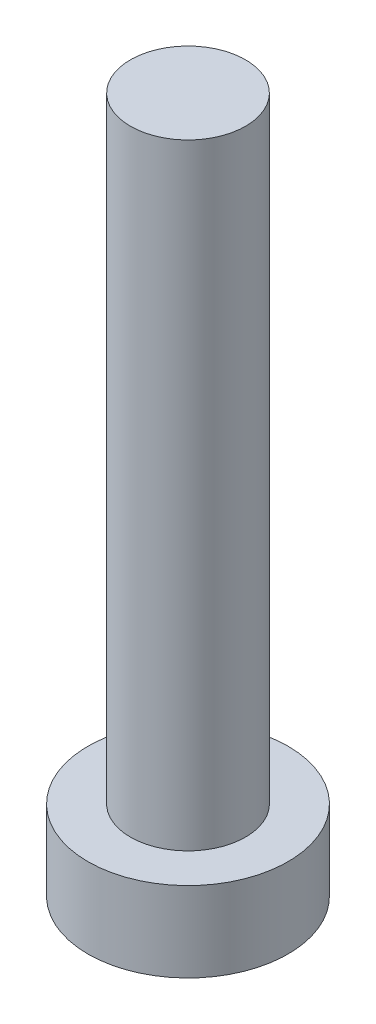
ISO-10303-21;
HEADER;
FILE_DESCRIPTION(('STEP AP214'),'2;1');
FILE_NAME('part.step','',(''),(''),'','','');
FILE_SCHEMA(('AUTOMOTIVE_DESIGN { 1 0 10303 214 1 1 1 1 }'));
ENDSEC;
DATA;
#1=APPLICATION_CONTEXT('core data for automotive mechanical design processes');
#2=APPLICATION_PROTOCOL_DEFINITION('international standard','automotive_design',2000,#1);
#3=PRODUCT_CONTEXT('',#1,'mechanical');
#4=PRODUCT('Part','Part','',(#3));
#5=PRODUCT_RELATED_PRODUCT_CATEGORY('part','',(#4));
#6=PRODUCT_DEFINITION_FORMATION('','',#4);
#7=PRODUCT_DEFINITION_CONTEXT('part definition',#1,'design');
#8=PRODUCT_DEFINITION('design','',#6,#7);
#9=PRODUCT_DEFINITION_SHAPE('','',#8);
#10=(LENGTH_UNIT() NAMED_UNIT(*) SI_UNIT(.MILLI.,.METRE.));
#11=(NAMED_UNIT(*) PLANE_ANGLE_UNIT() SI_UNIT($,.RADIAN.));
#12=(NAMED_UNIT(*) SI_UNIT($,.STERADIAN.) SOLID_ANGLE_UNIT());
#13=UNCERTAINTY_MEASURE_WITH_UNIT(LENGTH_MEASURE(1.E-05),#10,'distance_accuracy_value','');
#14=(GEOMETRIC_REPRESENTATION_CONTEXT(3) GLOBAL_UNCERTAINTY_ASSIGNED_CONTEXT((#13)) GLOBAL_UNIT_ASSIGNED_CONTEXT((#10,
#11,#12)) REPRESENTATION_CONTEXT('',''));
#15=CARTESIAN_POINT('',(0.,0.,0.));
#16=DIRECTION('',(0.,0.,1.));
#17=DIRECTION('',(1.,0.,0.));
#18=AXIS2_PLACEMENT_3D('',#15,#16,#17);
#19=CARTESIAN_POINT('',(0.,3.302,0.));
#20=DIRECTION('',(0.,1.,0.));
#21=DIRECTION('',(0.,0.,1.));
#22=AXIS2_PLACEMENT_3D('',#19,#20,#21);
#23=PLANE('',#22);
#24=CARTESIAN_POINT('',(0.,3.302,0.));
#25=DIRECTION('',(0.,1.,0.));
#26=DIRECTION('',(0.,0.,1.));
#27=AXIS2_PLACEMENT_3D('',#24,#25,#26);
#28=CIRCLE('',#27,4.1275);
#29=CARTESIAN_POINT('',(0.,3.302,-4.1275));
#30=VERTEX_POINT('',#29);
#31=EDGE_CURVE('E10',#30,#30,#28,.T.);
#32=ORIENTED_EDGE('',*,*,#31,.T.);
#33=EDGE_LOOP('',(#32));
#34=FACE_BOUND('',#33,.T.);
#35=CARTESIAN_POINT('',(0.,3.302,0.));
#36=DIRECTION('',(0.,1.,0.));
#37=DIRECTION('',(0.,0.,1.));
#38=AXIS2_PLACEMENT_3D('',#35,#36,#37);
#39=CIRCLE('',#38,2.3749);
#40=CARTESIAN_POINT('',(0.,3.302,2.3749));
#41=VERTEX_POINT('',#40);
#42=EDGE_CURVE('E44',#41,#41,#39,.T.);
#43=ORIENTED_EDGE('',*,*,#42,.F.);
#44=EDGE_LOOP('',(#43));
#45=FACE_BOUND('',#44,.T.);
#46=ADVANCED_FACE('F31',(#34,#45),#23,.T.);
#47=CARTESIAN_POINT('',(0.,3.302,0.));
#48=DIRECTION('',(0.,-1.,0.));
#49=DIRECTION('',(0.,0.,-1.));
#50=AXIS2_PLACEMENT_3D('',#47,#48,#49);
#51=CYLINDRICAL_SURFACE('',#50,4.1275);
#52=CARTESIAN_POINT('',(0.,0.,0.));
#53=DIRECTION('',(0.,1.,0.));
#54=DIRECTION('',(0.,0.,1.));
#55=AXIS2_PLACEMENT_3D('',#52,#53,#54);
#56=CIRCLE('',#55,4.1275);
#57=CARTESIAN_POINT('',(0.,0.,-4.1275));
#58=VERTEX_POINT('',#57);
#59=EDGE_CURVE('E35',#58,#58,#56,.T.);
#60=CARTESIAN_POINT('',(0.,3.302,-4.1275));
#61=CARTESIAN_POINT('',(0.,3.26760416666667,-4.1275));
#62=CARTESIAN_POINT('',(0.,3.23320833333333,-4.1275));
#63=CARTESIAN_POINT('',(0.,3.16441666666667,-4.1275));
#64=CARTESIAN_POINT('',(0.,3.13002083333333,-4.1275));
#65=CARTESIAN_POINT('',(0.,3.06122916666667,-4.1275));
#66=CARTESIAN_POINT('',(0.,3.02683333333333,-4.1275));
#67=CARTESIAN_POINT('',(0.,2.95804166666667,-4.1275));
#68=CARTESIAN_POINT('',(0.,2.92364583333333,-4.1275));
#69=CARTESIAN_POINT('',(0.,2.85485416666667,-4.1275));
#70=CARTESIAN_POINT('',(0.,2.82045833333333,-4.1275));
#71=CARTESIAN_POINT('',(0.,2.75166666666667,-4.1275));
#72=CARTESIAN_POINT('',(0.,2.71727083333333,-4.1275));
#73=CARTESIAN_POINT('',(0.,2.64847916666667,-4.1275));
#74=CARTESIAN_POINT('',(0.,2.61408333333333,-4.1275));
#75=CARTESIAN_POINT('',(0.,2.54529166666667,-4.1275));
#76=CARTESIAN_POINT('',(0.,2.51089583333333,-4.1275));
#77=CARTESIAN_POINT('',(0.,2.44210416666667,-4.1275));
#78=CARTESIAN_POINT('',(0.,2.40770833333333,-4.1275));
#79=CARTESIAN_POINT('',(0.,2.33891666666667,-4.1275));
#80=CARTESIAN_POINT('',(0.,2.30452083333333,-4.1275));
#81=CARTESIAN_POINT('',(0.,2.23572916666667,-4.1275));
#82=CARTESIAN_POINT('',(0.,2.20133333333333,-4.1275));
#83=CARTESIAN_POINT('',(0.,2.13254166666667,-4.1275));
#84=CARTESIAN_POINT('',(0.,2.09814583333333,-4.1275));
#85=CARTESIAN_POINT('',(0.,2.02935416666667,-4.1275));
#86=CARTESIAN_POINT('',(0.,1.99495833333333,-4.1275));
#87=CARTESIAN_POINT('',(0.,1.92616666666667,-4.1275));
#88=CARTESIAN_POINT('',(0.,1.89177083333333,-4.1275));
#89=CARTESIAN_POINT('',(0.,1.82297916666667,-4.1275));
#90=CARTESIAN_POINT('',(0.,1.78858333333333,-4.1275));
#91=CARTESIAN_POINT('',(0.,1.71979166666667,-4.1275));
#92=CARTESIAN_POINT('',(0.,1.68539583333333,-4.1275));
#93=CARTESIAN_POINT('',(0.,1.61660416666667,-4.1275));
#94=CARTESIAN_POINT('',(0.,1.58220833333333,-4.1275));
#95=CARTESIAN_POINT('',(0.,1.51341666666667,-4.1275));
#96=CARTESIAN_POINT('',(0.,1.47902083333333,-4.1275));
#97=CARTESIAN_POINT('',(0.,1.41022916666667,-4.1275));
#98=CARTESIAN_POINT('',(0.,1.37583333333333,-4.1275));
#99=CARTESIAN_POINT('',(0.,1.30704166666667,-4.1275));
#100=CARTESIAN_POINT('',(0.,1.27264583333333,-4.1275));
#101=CARTESIAN_POINT('',(0.,1.20385416666667,-4.1275));
#102=CARTESIAN_POINT('',(0.,1.16945833333333,-4.1275));
#103=CARTESIAN_POINT('',(0.,1.10066666666667,-4.1275));
#104=CARTESIAN_POINT('',(0.,1.06627083333333,-4.1275));
#105=CARTESIAN_POINT('',(0.,0.997479166666667,-4.1275));
#106=CARTESIAN_POINT('',(0.,0.963083333333334,-4.1275));
#107=CARTESIAN_POINT('',(0.,0.894291666666667,-4.1275));
#108=CARTESIAN_POINT('',(0.,0.859895833333333,-4.1275));
#109=CARTESIAN_POINT('',(0.,0.791104166666666,-4.1275));
#110=CARTESIAN_POINT('',(0.,0.756708333333333,-4.1275));
#111=CARTESIAN_POINT('',(0.,0.687916666666667,-4.1275));
#112=CARTESIAN_POINT('',(0.,0.653520833333333,-4.1275));
#113=CARTESIAN_POINT('',(0.,0.584729166666667,-4.1275));
#114=CARTESIAN_POINT('',(0.,0.550333333333333,-4.1275));
#115=CARTESIAN_POINT('',(0.,0.481541666666667,-4.1275));
#116=CARTESIAN_POINT('',(0.,0.447145833333333,-4.1275));
#117=CARTESIAN_POINT('',(0.,0.378354166666667,-4.1275));
#118=CARTESIAN_POINT('',(0.,0.343958333333333,-4.1275));
#119=CARTESIAN_POINT('',(0.,0.275166666666667,-4.1275));
#120=CARTESIAN_POINT('',(0.,0.240770833333333,-4.1275));
#121=CARTESIAN_POINT('',(0.,0.171979166666667,-4.1275));
#122=CARTESIAN_POINT('',(0.,0.137583333333333,-4.1275));
#123=CARTESIAN_POINT('',(0.,0.0687916666666666,-4.1275));
#124=CARTESIAN_POINT('',(0.,0.0343958333333333,-4.1275));
#125=CARTESIAN_POINT('',(0.,0.,-4.1275));
#126=B_SPLINE_CURVE_WITH_KNOTS('',3,(#60,#61,#62,#63,#64,#65,#66,#67,#68,#69,#70,#71,#72,#73,
#74,#75,#76,#77,#78,#79,#80,#81,#82,#83,#84,#85,#86,#87,#88,#89,#90,#91,#92,#93,#94,#95,#96,#97,
#98,#99,#100,#101,#102,#103,#104,#105,#106,#107,#108,#109,#110,#111,#112,#113,#114,#115,#116,
#117,#118,#119,#120,#121,#122,#123,#124,#125),.UNSPECIFIED.,.F.,.F.,(4,2,2,2,2,2,2,2,2,2,2,2,2,
2,2,2,2,2,2,2,2,2,2,2,2,2,2,2,2,2,2,2,4),(0.,0.1031875,0.206375,0.3095625,0.41275,0.5159375,
0.619125,0.7223125,0.8255,0.9286875,1.031875,1.1350625,1.23825,1.3414375,1.444625,1.5478125,
1.651,1.7541875,1.857375,1.9605625,2.06375,2.1669375,2.270125,2.3733125,2.4765,2.5796875,
2.682875,2.7860625,2.88925,2.9924375,3.095625,3.1988125,3.302),.UNSPECIFIED.);
#127=EDGE_CURVE('BSEAM33',#30,#58,#126,.T.);
#128=ORIENTED_EDGE('',*,*,#31,.F.);
#129=ORIENTED_EDGE('',*,*,#59,.T.);
#130=ORIENTED_EDGE('',*,*,#127,.T.);
#131=ORIENTED_EDGE('',*,*,#127,.F.);
#132=EDGE_LOOP('',(#128,#130,#129,#131));
#133=FACE_BOUND('',#132,.T.);
#134=ADVANCED_FACE('F33',(#133),#51,.T.);
#135=CARTESIAN_POINT('',(0.,0.,0.));
#136=DIRECTION('',(0.,1.,0.));
#137=DIRECTION('',(0.,0.,1.));
#138=AXIS2_PLACEMENT_3D('',#135,#136,#137);
#139=PLANE('',#138);
#140=ORIENTED_EDGE('',*,*,#59,.F.);
#141=EDGE_LOOP('',(#140));
#142=FACE_BOUND('',#141,.T.);
#143=ADVANCED_FACE('F55',(#142),#139,.F.);
#144=CARTESIAN_POINT('',(0.,28.702,0.));
#145=DIRECTION('',(0.,-1.,0.));
#146=DIRECTION('',(0.,0.,-1.));
#147=AXIS2_PLACEMENT_3D('',#144,#145,#146);
#148=CYLINDRICAL_SURFACE('',#147,2.3749);
#149=CARTESIAN_POINT('',(0.,28.702,0.));
#150=DIRECTION('',(0.,1.,0.));
#151=DIRECTION('',(0.,0.,1.));
#152=AXIS2_PLACEMENT_3D('',#149,#150,#151);
#153=CIRCLE('',#152,2.3749);
#154=CARTESIAN_POINT('',(0.,28.702,2.3749));
#155=VERTEX_POINT('',#154);
#156=EDGE_CURVE('E42',#155,#155,#153,.T.);
#157=ORIENTED_EDGE('',*,*,#156,.F.);
#158=EDGE_LOOP('',(#157));
#159=FACE_BOUND('',#158,.T.);
#160=ORIENTED_EDGE('',*,*,#42,.T.);
#161=EDGE_LOOP('',(#160));
#162=FACE_BOUND('',#161,.T.);
#163=ADVANCED_FACE('F52',(#159,#162),#148,.T.);
#164=CARTESIAN_POINT('',(0.,28.702,0.));
#165=DIRECTION('',(0.,1.,0.));
#166=DIRECTION('',(0.,0.,1.));
#167=AXIS2_PLACEMENT_3D('',#164,#165,#166);
#168=PLANE('',#167);
#169=ORIENTED_EDGE('',*,*,#156,.T.);
#170=EDGE_LOOP('',(#169));
#171=FACE_BOUND('',#170,.T.);
#172=ADVANCED_FACE('F50',(#171),#168,.T.);
#173=CLOSED_SHELL('',(#46,#134,#143,#163,#172));
#174=MANIFOLD_SOLID_BREP('B2',#173);
#175=ADVANCED_BREP_SHAPE_REPRESENTATION('',(#18,#174),#14);
#176=SHAPE_DEFINITION_REPRESENTATION(#9,#175);
ENDSEC;
END-ISO-10303-21;
